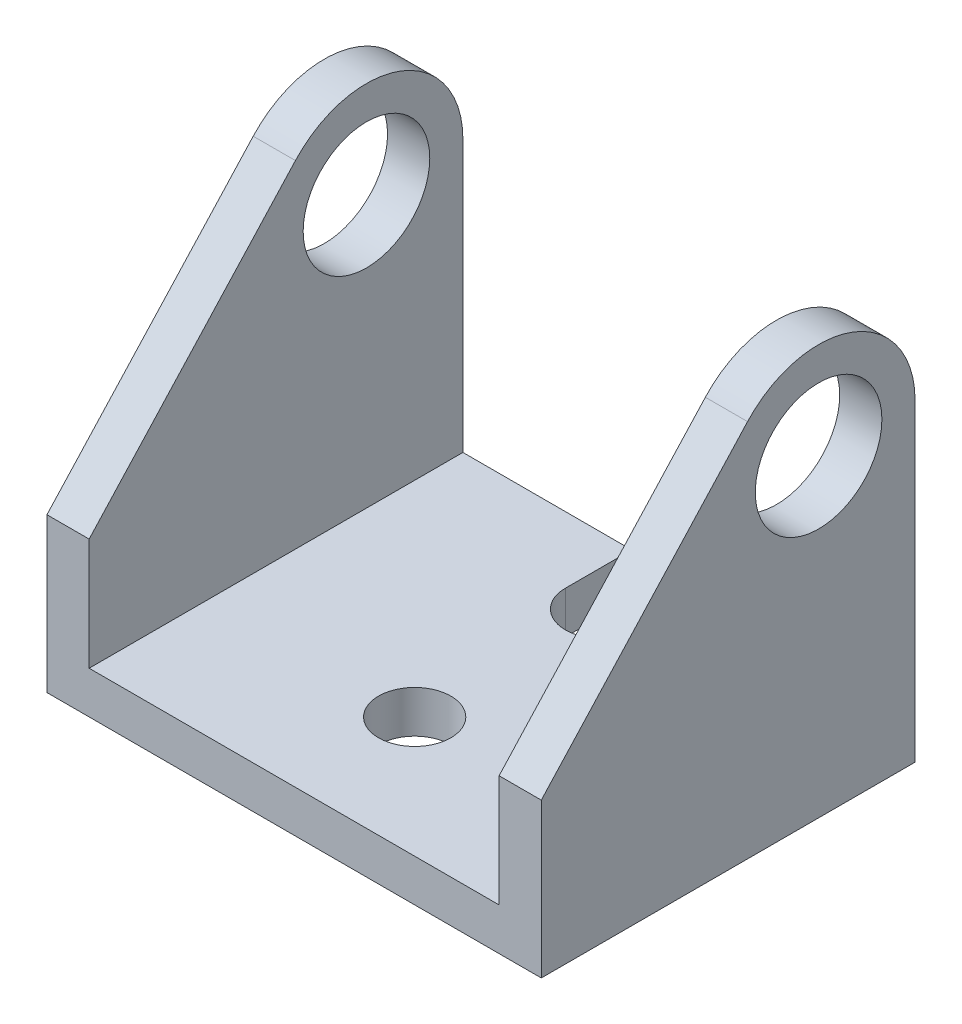
ISO-10303-21;
HEADER;
FILE_DESCRIPTION(('STEP AP214'),'2;1');
FILE_NAME('part.step','',(''),(''),'','','');
FILE_SCHEMA(('AUTOMOTIVE_DESIGN { 1 0 10303 214 1 1 1 1 }'));
ENDSEC;
DATA;
#1=APPLICATION_CONTEXT('core data for automotive mechanical design processes');
#2=APPLICATION_PROTOCOL_DEFINITION('international standard','automotive_design',2000,#1);
#3=PRODUCT_CONTEXT('',#1,'mechanical');
#4=PRODUCT('Part','Part','',(#3));
#5=PRODUCT_RELATED_PRODUCT_CATEGORY('part','',(#4));
#6=PRODUCT_DEFINITION_FORMATION('','',#4);
#7=PRODUCT_DEFINITION_CONTEXT('part definition',#1,'design');
#8=PRODUCT_DEFINITION('design','',#6,#7);
#9=PRODUCT_DEFINITION_SHAPE('','',#8);
#10=(LENGTH_UNIT() NAMED_UNIT(*) SI_UNIT(.MILLI.,.METRE.));
#11=(NAMED_UNIT(*) PLANE_ANGLE_UNIT() SI_UNIT($,.RADIAN.));
#12=(NAMED_UNIT(*) SI_UNIT($,.STERADIAN.) SOLID_ANGLE_UNIT());
#13=UNCERTAINTY_MEASURE_WITH_UNIT(LENGTH_MEASURE(1.E-05),#10,'distance_accuracy_value','');
#14=(GEOMETRIC_REPRESENTATION_CONTEXT(3) GLOBAL_UNCERTAINTY_ASSIGNED_CONTEXT((#13)) GLOBAL_UNIT_ASSIGNED_CONTEXT((#10,
#11,#12)) REPRESENTATION_CONTEXT('',''));
#15=CARTESIAN_POINT('',(0.,0.,0.));
#16=DIRECTION('',(0.,0.,1.));
#17=DIRECTION('',(1.,0.,0.));
#18=AXIS2_PLACEMENT_3D('',#15,#16,#17);
#19=CARTESIAN_POINT('',(-20.5,3.5,-15.5));
#20=DIRECTION('',(0.,0.,1.));
#21=DIRECTION('',(1.,0.,0.));
#22=AXIS2_PLACEMENT_3D('',#19,#20,#21);
#23=PLANE('',#22);
#24=DIRECTION('',(-1.,0.,0.));
#25=VECTOR('',#24,1.);
#26=CARTESIAN_POINT('',(-20.5,3.5,-15.5));
#27=LINE('',#26,#25);
#28=CARTESIAN_POINT('',(-3.,3.5,-15.5));
#29=VERTEX_POINT('',#28);
#30=CARTESIAN_POINT('',(-17.,3.5,-15.5));
#31=VERTEX_POINT('',#30);
#32=EDGE_CURVE('E221',#29,#31,#27,.T.);
#33=ORIENTED_EDGE('',*,*,#32,.F.);
#34=DIRECTION('',(0.,1.,0.));
#35=VECTOR('',#34,1.);
#36=CARTESIAN_POINT('',(-3.,-36.5,-15.5));
#37=LINE('',#36,#35);
#38=CARTESIAN_POINT('',(-3.,0.,-15.5));
#39=VERTEX_POINT('',#38);
#40=EDGE_CURVE('E165',#39,#29,#37,.T.);
#41=ORIENTED_EDGE('',*,*,#40,.F.);
#42=DIRECTION('',(-1.,0.,0.));
#43=VECTOR('',#42,1.);
#44=CARTESIAN_POINT('',(-20.5,0.,-15.5));
#45=LINE('',#44,#43);
#46=CARTESIAN_POINT('',(-20.5,0.,-15.5));
#47=VERTEX_POINT('',#46);
#48=EDGE_CURVE('E227',#39,#47,#45,.T.);
#49=ORIENTED_EDGE('',*,*,#48,.T.);
#50=DIRECTION('',(0.,-1.,0.));
#51=VECTOR('',#50,1.);
#52=CARTESIAN_POINT('',(-20.5,3.5,-15.5));
#53=LINE('',#52,#51);
#54=CARTESIAN_POINT('',(-20.5,26.,-15.5));
#55=VERTEX_POINT('',#54);
#56=EDGE_CURVE('E240',#55,#47,#53,.T.);
#57=ORIENTED_EDGE('',*,*,#56,.F.);
#58=DIRECTION('',(1.,0.,0.));
#59=VECTOR('',#58,1.);
#60=CARTESIAN_POINT('',(-20.5,26.,-15.5));
#61=LINE('',#60,#59);
#62=CARTESIAN_POINT('',(-17.,26.,-15.5));
#63=VERTEX_POINT('',#62);
#64=EDGE_CURVE('E186',#55,#63,#61,.T.);
#65=ORIENTED_EDGE('',*,*,#64,.T.);
#66=DIRECTION('',(0.,-1.,0.));
#67=VECTOR('',#66,1.);
#68=CARTESIAN_POINT('',(-17.,43.5,-15.5));
#69=LINE('',#68,#67);
#70=EDGE_CURVE('E213',#63,#31,#69,.T.);
#71=ORIENTED_EDGE('',*,*,#70,.T.);
#72=EDGE_LOOP('',(#33,#41,#49,#57,#65,#71));
#73=FACE_BOUND('',#72,.T.);
#74=ADVANCED_FACE('F35',(#73),#23,.F.);
#75=CARTESIAN_POINT('',(20.5,0.,-15.5));
#76=VERTEX_POINT('',#75);
#77=CARTESIAN_POINT('',(3.,0.,-15.5));
#78=VERTEX_POINT('',#77);
#79=EDGE_CURVE('E228',#76,#78,#45,.T.);
#80=ORIENTED_EDGE('',*,*,#79,.T.);
#81=DIRECTION('',(0.,1.,0.));
#82=VECTOR('',#81,1.);
#83=CARTESIAN_POINT('',(3.,-36.5,-15.5));
#84=LINE('',#83,#82);
#85=CARTESIAN_POINT('',(3.,3.5,-15.5));
#86=VERTEX_POINT('',#85);
#87=EDGE_CURVE('E51',#78,#86,#84,.T.);
#88=ORIENTED_EDGE('',*,*,#87,.T.);
#89=CARTESIAN_POINT('',(17.,3.5,-15.5));
#90=VERTEX_POINT('',#89);
#91=EDGE_CURVE('E158',#90,#86,#27,.T.);
#92=ORIENTED_EDGE('',*,*,#91,.F.);
#93=DIRECTION('',(0.,-1.,0.));
#94=VECTOR('',#93,1.);
#95=CARTESIAN_POINT('',(17.,43.5,-15.5));
#96=LINE('',#95,#94);
#97=CARTESIAN_POINT('',(17.,26.,-15.5));
#98=VERTEX_POINT('',#97);
#99=EDGE_CURVE('E208',#98,#90,#96,.T.);
#100=ORIENTED_EDGE('',*,*,#99,.F.);
#101=CARTESIAN_POINT('',(20.5,26.,-15.5));
#102=VERTEX_POINT('',#101);
#103=EDGE_CURVE('E175',#98,#102,#61,.T.);
#104=ORIENTED_EDGE('',*,*,#103,.T.);
#105=DIRECTION('',(0.,-1.,0.));
#106=VECTOR('',#105,1.);
#107=CARTESIAN_POINT('',(20.5,3.5,-15.5));
#108=LINE('',#107,#106);
#109=EDGE_CURVE('E243',#102,#76,#108,.T.);
#110=ORIENTED_EDGE('',*,*,#109,.T.);
#111=EDGE_LOOP('',(#80,#88,#92,#100,#104,#110));
#112=FACE_BOUND('',#111,.T.);
#113=ADVANCED_FACE('F279',(#112),#23,.F.);
#114=CARTESIAN_POINT('',(0.,3.5,0.));
#115=DIRECTION('',(0.,1.,0.));
#116=DIRECTION('',(0.,0.,1.));
#117=AXIS2_PLACEMENT_3D('',#114,#115,#116);
#118=PLANE('',#117);
#119=CARTESIAN_POINT('',(0.,3.5,5.5));
#120=DIRECTION('',(0.,1.,0.));
#121=DIRECTION('',(0.,0.,1.));
#122=AXIS2_PLACEMENT_3D('',#119,#120,#121);
#123=CIRCLE('',#122,3.);
#124=CARTESIAN_POINT('',(0.,3.5,8.5));
#125=VERTEX_POINT('',#124);
#126=EDGE_CURVE('E459',#125,#125,#123,.T.);
#127=ORIENTED_EDGE('',*,*,#126,.F.);
#128=EDGE_LOOP('',(#127));
#129=FACE_BOUND('',#128,.T.);
#130=DIRECTION('',(0.,0.,1.));
#131=VECTOR('',#130,1.);
#132=CARTESIAN_POINT('',(-3.,3.5,-10.));
#133=LINE('',#132,#131);
#134=CARTESIAN_POINT('',(-3.,3.5,-10.));
#135=VERTEX_POINT('',#134);
#136=EDGE_CURVE('E143',#29,#135,#133,.T.);
#137=ORIENTED_EDGE('',*,*,#136,.F.);
#138=ORIENTED_EDGE('',*,*,#32,.T.);
#139=DIRECTION('',(0.,0.,-1.));
#140=VECTOR('',#139,1.);
#141=CARTESIAN_POINT('',(-17.,3.5,-15.5));
#142=LINE('',#141,#140);
#143=CARTESIAN_POINT('',(-17.,3.5,15.5));
#144=VERTEX_POINT('',#143);
#145=EDGE_CURVE('E210',#144,#31,#142,.T.);
#146=ORIENTED_EDGE('',*,*,#145,.F.);
#147=DIRECTION('',(1.,0.,0.));
#148=VECTOR('',#147,1.);
#149=CARTESIAN_POINT('',(-20.5,3.5,15.5));
#150=LINE('',#149,#148);
#151=CARTESIAN_POINT('',(17.,3.5,15.5));
#152=VERTEX_POINT('',#151);
#153=EDGE_CURVE('E220',#144,#152,#150,.T.);
#154=ORIENTED_EDGE('',*,*,#153,.T.);
#155=DIRECTION('',(0.,0.,1.));
#156=VECTOR('',#155,1.);
#157=CARTESIAN_POINT('',(17.,3.5,-15.5));
#158=LINE('',#157,#156);
#159=EDGE_CURVE('E203',#90,#152,#158,.T.);
#160=ORIENTED_EDGE('',*,*,#159,.F.);
#161=ORIENTED_EDGE('',*,*,#91,.T.);
#162=DIRECTION('',(0.,0.,-1.));
#163=VECTOR('',#162,1.);
#164=CARTESIAN_POINT('',(3.,3.5,-10.));
#165=LINE('',#164,#163);
#166=CARTESIAN_POINT('',(3.,3.5,-10.));
#167=VERTEX_POINT('',#166);
#168=EDGE_CURVE('E139',#167,#86,#165,.T.);
#169=ORIENTED_EDGE('',*,*,#168,.F.);
#170=CARTESIAN_POINT('',(0.,3.5,-10.));
#171=DIRECTION('',(0.,1.,0.));
#172=DIRECTION('',(0.,0.,1.));
#173=AXIS2_PLACEMENT_3D('',#170,#171,#172);
#174=CIRCLE('',#173,3.);
#175=EDGE_CURVE('E146',#135,#167,#174,.T.);
#176=ORIENTED_EDGE('',*,*,#175,.F.);
#177=EDGE_LOOP('',(#137,#138,#146,#154,#160,#161,#169,#176));
#178=FACE_BOUND('',#177,.T.);
#179=ADVANCED_FACE('F155',(#129,#178),#118,.T.);
#180=CARTESIAN_POINT('',(20.5,3.5,-15.5));
#181=DIRECTION('',(-1.,0.,0.));
#182=DIRECTION('',(0.,0.,1.));
#183=AXIS2_PLACEMENT_3D('',#180,#181,#182);
#184=PLANE('',#183);
#185=CARTESIAN_POINT('',(20.5,26.,-7.5));
#186=DIRECTION('',(1.,0.,0.));
#187=DIRECTION('',(0.,0.,-1.));
#188=AXIS2_PLACEMENT_3D('',#185,#186,#187);
#189=CIRCLE('',#188,5.25);
#190=CARTESIAN_POINT('',(20.5,26.,-12.75));
#191=VERTEX_POINT('',#190);
#192=EDGE_CURVE('E193',#191,#191,#189,.T.);
#193=ORIENTED_EDGE('',*,*,#192,.F.);
#194=EDGE_LOOP('',(#193));
#195=FACE_BOUND('',#194,.T.);
#196=ORIENTED_EDGE('',*,*,#109,.F.);
#197=CARTESIAN_POINT('',(20.5,26.,-7.5));
#198=DIRECTION('',(-1.,0.,0.));
#199=DIRECTION('',(0.,0.,-1.));
#200=AXIS2_PLACEMENT_3D('',#197,#198,#199);
#201=CIRCLE('',#200,8.);
#202=CARTESIAN_POINT('',(20.5,31.4103668795127,-1.60695916957365));
#203=VERTEX_POINT('',#202);
#204=EDGE_CURVE('E164',#203,#102,#201,.T.);
#205=ORIENTED_EDGE('',*,*,#204,.F.);
#206=DIRECTION('',(0.,0.736630103803293,-0.676295859939087));
#207=VECTOR('',#206,1.);
#208=CARTESIAN_POINT('',(20.5,31.4103668795127,-1.60695916957365));
#209=LINE('',#208,#207);
#210=CARTESIAN_POINT('',(20.5,12.7772480696818,15.5));
#211=VERTEX_POINT('',#210);
#212=EDGE_CURVE('E172',#211,#203,#209,.T.);
#213=ORIENTED_EDGE('',*,*,#212,.F.);
#214=DIRECTION('',(0.,-1.,0.));
#215=VECTOR('',#214,1.);
#216=CARTESIAN_POINT('',(20.5,3.5,15.5));
#217=LINE('',#216,#215);
#218=CARTESIAN_POINT('',(20.5,0.,15.5));
#219=VERTEX_POINT('',#218);
#220=EDGE_CURVE('E224',#211,#219,#217,.T.);
#221=ORIENTED_EDGE('',*,*,#220,.T.);
#222=DIRECTION('',(0.,0.,-1.));
#223=VECTOR('',#222,1.);
#224=CARTESIAN_POINT('',(20.5,0.,-15.5));
#225=LINE('',#224,#223);
#226=EDGE_CURVE('E218',#219,#76,#225,.T.);
#227=ORIENTED_EDGE('',*,*,#226,.T.);
#228=EDGE_LOOP('',(#196,#205,#213,#221,#227));
#229=FACE_BOUND('',#228,.T.);
#230=ADVANCED_FACE('F37',(#195,#229),#184,.F.);
#231=CARTESIAN_POINT('',(-20.5,3.5,-15.5));
#232=DIRECTION('',(1.,0.,0.));
#233=DIRECTION('',(0.,0.,-1.));
#234=AXIS2_PLACEMENT_3D('',#231,#232,#233);
#235=PLANE('',#234);
#236=CARTESIAN_POINT('',(-20.5,26.,-7.5));
#237=DIRECTION('',(1.,0.,0.));
#238=DIRECTION('',(0.,0.,-1.));
#239=AXIS2_PLACEMENT_3D('',#236,#237,#238);
#240=CIRCLE('',#239,5.25);
#241=CARTESIAN_POINT('',(-20.5,26.,-12.75));
#242=VERTEX_POINT('',#241);
#243=EDGE_CURVE('E194',#242,#242,#240,.T.);
#244=ORIENTED_EDGE('',*,*,#243,.T.);
#245=EDGE_LOOP('',(#244));
#246=FACE_BOUND('',#245,.T.);
#247=DIRECTION('',(0.,0.736630103803293,-0.676295859939087));
#248=VECTOR('',#247,1.);
#249=CARTESIAN_POINT('',(-20.5,31.4103668795127,-1.60695916957365));
#250=LINE('',#249,#248);
#251=CARTESIAN_POINT('',(-20.5,12.7772480696818,15.5));
#252=VERTEX_POINT('',#251);
#253=CARTESIAN_POINT('',(-20.5,31.4103668795127,-1.60695916957365));
#254=VERTEX_POINT('',#253);
#255=EDGE_CURVE('E171',#252,#254,#250,.T.);
#256=ORIENTED_EDGE('',*,*,#255,.T.);
#257=CARTESIAN_POINT('',(-20.5,26.,-7.5));
#258=DIRECTION('',(-1.,0.,0.));
#259=DIRECTION('',(0.,0.,-1.));
#260=AXIS2_PLACEMENT_3D('',#257,#258,#259);
#261=CIRCLE('',#260,8.);
#262=EDGE_CURVE('E168',#254,#55,#261,.T.);
#263=ORIENTED_EDGE('',*,*,#262,.T.);
#264=ORIENTED_EDGE('',*,*,#56,.T.);
#265=DIRECTION('',(0.,0.,1.));
#266=VECTOR('',#265,1.);
#267=CARTESIAN_POINT('',(-20.5,0.,-15.5));
#268=LINE('',#267,#266);
#269=CARTESIAN_POINT('',(-20.5,0.,15.5));
#270=VERTEX_POINT('',#269);
#271=EDGE_CURVE('E231',#47,#270,#268,.T.);
#272=ORIENTED_EDGE('',*,*,#271,.T.);
#273=DIRECTION('',(0.,-1.,0.));
#274=VECTOR('',#273,1.);
#275=CARTESIAN_POINT('',(-20.5,3.5,15.5));
#276=LINE('',#275,#274);
#277=EDGE_CURVE('E238',#252,#270,#276,.T.);
#278=ORIENTED_EDGE('',*,*,#277,.F.);
#279=EDGE_LOOP('',(#256,#263,#264,#272,#278));
#280=FACE_BOUND('',#279,.T.);
#281=ADVANCED_FACE('F290',(#246,#280),#235,.F.);
#282=CARTESIAN_POINT('',(-20.5,3.5,15.5));
#283=DIRECTION('',(0.,0.,-1.));
#284=DIRECTION('',(-1.,0.,0.));
#285=AXIS2_PLACEMENT_3D('',#282,#283,#284);
#286=PLANE('',#285);
#287=ORIENTED_EDGE('',*,*,#220,.F.);
#288=DIRECTION('',(1.,0.,0.));
#289=VECTOR('',#288,1.);
#290=CARTESIAN_POINT('',(-20.5,12.7772480696818,15.5));
#291=LINE('',#290,#289);
#292=CARTESIAN_POINT('',(17.,12.7772480696818,15.5));
#293=VERTEX_POINT('',#292);
#294=EDGE_CURVE('E185',#293,#211,#291,.T.);
#295=ORIENTED_EDGE('',*,*,#294,.F.);
#296=DIRECTION('',(0.,-1.,0.));
#297=VECTOR('',#296,1.);
#298=CARTESIAN_POINT('',(17.,43.5,15.5));
#299=LINE('',#298,#297);
#300=EDGE_CURVE('E206',#293,#152,#299,.T.);
#301=ORIENTED_EDGE('',*,*,#300,.T.);
#302=ORIENTED_EDGE('',*,*,#153,.F.);
#303=DIRECTION('',(0.,-1.,0.));
#304=VECTOR('',#303,1.);
#305=CARTESIAN_POINT('',(-17.,43.5,15.5));
#306=LINE('',#305,#304);
#307=CARTESIAN_POINT('',(-17.,12.7772480696818,15.5));
#308=VERTEX_POINT('',#307);
#309=EDGE_CURVE('E216',#308,#144,#306,.T.);
#310=ORIENTED_EDGE('',*,*,#309,.F.);
#311=EDGE_CURVE('E59',#252,#308,#291,.T.);
#312=ORIENTED_EDGE('',*,*,#311,.F.);
#313=ORIENTED_EDGE('',*,*,#277,.T.);
#314=DIRECTION('',(1.,0.,0.));
#315=VECTOR('',#314,1.);
#316=CARTESIAN_POINT('',(-20.5,0.,15.5));
#317=LINE('',#316,#315);
#318=EDGE_CURVE('E234',#270,#219,#317,.T.);
#319=ORIENTED_EDGE('',*,*,#318,.T.);
#320=EDGE_LOOP('',(#287,#295,#301,#302,#310,#312,#313,#319));
#321=FACE_BOUND('',#320,.T.);
#322=ADVANCED_FACE('F272',(#321),#286,.F.);
#323=CARTESIAN_POINT('',(0.,0.,0.));
#324=DIRECTION('',(0.,1.,0.));
#325=DIRECTION('',(0.,0.,1.));
#326=AXIS2_PLACEMENT_3D('',#323,#324,#325);
#327=PLANE('',#326);
#328=CARTESIAN_POINT('',(0.,0.,5.5));
#329=DIRECTION('',(0.,1.,0.));
#330=DIRECTION('',(0.,0.,1.));
#331=AXIS2_PLACEMENT_3D('',#328,#329,#330);
#332=CIRCLE('',#331,3.);
#333=CARTESIAN_POINT('',(0.,0.,8.5));
#334=VERTEX_POINT('',#333);
#335=EDGE_CURVE('E39',#334,#334,#332,.T.);
#336=ORIENTED_EDGE('',*,*,#335,.T.);
#337=EDGE_LOOP('',(#336));
#338=FACE_BOUND('',#337,.T.);
#339=ORIENTED_EDGE('',*,*,#48,.F.);
#340=DIRECTION('',(0.,0.,1.));
#341=VECTOR('',#340,1.);
#342=CARTESIAN_POINT('',(-3.,0.,0.));
#343=LINE('',#342,#341);
#344=CARTESIAN_POINT('',(-3.,0.,-10.));
#345=VERTEX_POINT('',#344);
#346=EDGE_CURVE('E11',#39,#345,#343,.T.);
#347=ORIENTED_EDGE('',*,*,#346,.T.);
#348=CARTESIAN_POINT('',(0.,0.,-10.));
#349=DIRECTION('',(0.,1.,0.));
#350=DIRECTION('',(0.,0.,1.));
#351=AXIS2_PLACEMENT_3D('',#348,#349,#350);
#352=CIRCLE('',#351,3.);
#353=CARTESIAN_POINT('',(3.,0.,-10.));
#354=VERTEX_POINT('',#353);
#355=EDGE_CURVE('E44',#345,#354,#352,.T.);
#356=ORIENTED_EDGE('',*,*,#355,.T.);
#357=DIRECTION('',(0.,0.,-1.));
#358=VECTOR('',#357,1.);
#359=CARTESIAN_POINT('',(3.,0.,0.));
#360=LINE('',#359,#358);
#361=EDGE_CURVE('E140',#354,#78,#360,.T.);
#362=ORIENTED_EDGE('',*,*,#361,.T.);
#363=ORIENTED_EDGE('',*,*,#79,.F.);
#364=ORIENTED_EDGE('',*,*,#226,.F.);
#365=ORIENTED_EDGE('',*,*,#318,.F.);
#366=ORIENTED_EDGE('',*,*,#271,.F.);
#367=EDGE_LOOP('',(#339,#347,#356,#362,#363,#364,#365,#366));
#368=FACE_BOUND('',#367,.T.);
#369=ADVANCED_FACE('F256',(#338,#368),#327,.F.);
#370=CARTESIAN_POINT('',(-17.,43.5,-15.5));
#371=DIRECTION('',(-1.,0.,0.));
#372=DIRECTION('',(0.,0.,1.));
#373=AXIS2_PLACEMENT_3D('',#370,#371,#372);
#374=PLANE('',#373);
#375=CARTESIAN_POINT('',(-17.,26.,-7.5));
#376=DIRECTION('',(-1.,0.,0.));
#377=DIRECTION('',(0.,0.,1.));
#378=AXIS2_PLACEMENT_3D('',#375,#376,#377);
#379=CIRCLE('',#378,5.25);
#380=CARTESIAN_POINT('',(-17.,26.,-2.25));
#381=VERTEX_POINT('',#380);
#382=EDGE_CURVE('E200',#381,#381,#379,.T.);
#383=ORIENTED_EDGE('',*,*,#382,.T.);
#384=EDGE_LOOP('',(#383));
#385=FACE_BOUND('',#384,.T.);
#386=ORIENTED_EDGE('',*,*,#70,.F.);
#387=CARTESIAN_POINT('',(-17.,26.,-7.5));
#388=DIRECTION('',(-1.,0.,0.));
#389=DIRECTION('',(0.,0.,1.));
#390=AXIS2_PLACEMENT_3D('',#387,#388,#389);
#391=CIRCLE('',#390,8.);
#392=CARTESIAN_POINT('',(-17.,31.4103668795127,-1.60695916957365));
#393=VERTEX_POINT('',#392);
#394=EDGE_CURVE('E190',#63,#393,#391,.F.);
#395=ORIENTED_EDGE('',*,*,#394,.T.);
#396=DIRECTION('',(0.,-0.736630103803293,0.676295859939087));
#397=VECTOR('',#396,1.);
#398=CARTESIAN_POINT('',(-17.,44.8917244175939,-13.9841159573413));
#399=LINE('',#398,#397);
#400=EDGE_CURVE('E182',#393,#308,#399,.T.);
#401=ORIENTED_EDGE('',*,*,#400,.T.);
#402=ORIENTED_EDGE('',*,*,#309,.T.);
#403=ORIENTED_EDGE('',*,*,#145,.T.);
#404=EDGE_LOOP('',(#386,#395,#401,#402,#403));
#405=FACE_BOUND('',#404,.T.);
#406=ADVANCED_FACE('F267',(#385,#405),#374,.F.);
#407=CARTESIAN_POINT('',(17.,43.5,-15.5));
#408=DIRECTION('',(1.,0.,0.));
#409=DIRECTION('',(0.,0.,-1.));
#410=AXIS2_PLACEMENT_3D('',#407,#408,#409);
#411=PLANE('',#410);
#412=CARTESIAN_POINT('',(17.,26.,-7.5));
#413=DIRECTION('',(1.,0.,0.));
#414=DIRECTION('',(0.,0.,-1.));
#415=AXIS2_PLACEMENT_3D('',#412,#413,#414);
#416=CIRCLE('',#415,5.25);
#417=CARTESIAN_POINT('',(17.,26.,-12.75));
#418=VERTEX_POINT('',#417);
#419=EDGE_CURVE('E197',#418,#418,#416,.T.);
#420=ORIENTED_EDGE('',*,*,#419,.T.);
#421=EDGE_LOOP('',(#420));
#422=FACE_BOUND('',#421,.T.);
#423=DIRECTION('',(0.,0.736630103803293,-0.676295859939087));
#424=VECTOR('',#423,1.);
#425=CARTESIAN_POINT('',(17.,44.8917244175939,-13.9841159573413));
#426=LINE('',#425,#424);
#427=CARTESIAN_POINT('',(17.,31.4103668795127,-1.60695916957364));
#428=VERTEX_POINT('',#427);
#429=EDGE_CURVE('E245',#293,#428,#426,.T.);
#430=ORIENTED_EDGE('',*,*,#429,.T.);
#431=CARTESIAN_POINT('',(17.,26.,-7.5));
#432=DIRECTION('',(1.,0.,0.));
#433=DIRECTION('',(0.,0.,-1.));
#434=AXIS2_PLACEMENT_3D('',#431,#432,#433);
#435=CIRCLE('',#434,8.);
#436=EDGE_CURVE('E250',#428,#98,#435,.F.);
#437=ORIENTED_EDGE('',*,*,#436,.T.);
#438=ORIENTED_EDGE('',*,*,#99,.T.);
#439=ORIENTED_EDGE('',*,*,#159,.T.);
#440=ORIENTED_EDGE('',*,*,#300,.F.);
#441=EDGE_LOOP('',(#430,#437,#438,#439,#440));
#442=FACE_BOUND('',#441,.T.);
#443=ADVANCED_FACE('F276',(#422,#442),#411,.F.);
#444=CARTESIAN_POINT('',(-20.5,26.,-7.5));
#445=DIRECTION('',(1.,0.,0.));
#446=DIRECTION('',(0.,0.,-1.));
#447=AXIS2_PLACEMENT_3D('',#444,#445,#446);
#448=CYLINDRICAL_SURFACE('',#447,5.25);
#449=ORIENTED_EDGE('',*,*,#192,.T.);
#450=EDGE_LOOP('',(#449));
#451=FACE_BOUND('',#450,.T.);
#452=ORIENTED_EDGE('',*,*,#419,.F.);
#453=EDGE_LOOP('',(#452));
#454=FACE_BOUND('',#453,.T.);
#455=ADVANCED_FACE('F330',(#451,#454),#448,.F.);
#456=ORIENTED_EDGE('',*,*,#243,.F.);
#457=EDGE_LOOP('',(#456));
#458=FACE_BOUND('',#457,.T.);
#459=ORIENTED_EDGE('',*,*,#382,.F.);
#460=EDGE_LOOP('',(#459));
#461=FACE_BOUND('',#460,.T.);
#462=ADVANCED_FACE('F307',(#458,#461),#448,.F.);
#463=CARTESIAN_POINT('',(-20.5,31.4103668795127,-1.60695916957365));
#464=DIRECTION('',(0.,-0.676295859939087,-0.736630103803293));
#465=DIRECTION('',(0.,0.736630103803293,-0.676295859939087));
#466=AXIS2_PLACEMENT_3D('',#463,#464,#465);
#467=PLANE('',#466);
#468=ORIENTED_EDGE('',*,*,#294,.T.);
#469=ORIENTED_EDGE('',*,*,#212,.T.);
#470=DIRECTION('',(1.,0.,0.));
#471=VECTOR('',#470,1.);
#472=CARTESIAN_POINT('',(-20.5,31.4103668795127,-1.60695916957365));
#473=LINE('',#472,#471);
#474=EDGE_CURVE('E183',#428,#203,#473,.T.);
#475=ORIENTED_EDGE('',*,*,#474,.F.);
#476=ORIENTED_EDGE('',*,*,#429,.F.);
#477=EDGE_LOOP('',(#468,#469,#475,#476));
#478=FACE_BOUND('',#477,.T.);
#479=ADVANCED_FACE('F297',(#478),#467,.F.);
#480=CARTESIAN_POINT('',(-20.5,26.,-7.5));
#481=DIRECTION('',(1.,0.,0.));
#482=DIRECTION('',(0.,0.,-1.));
#483=AXIS2_PLACEMENT_3D('',#480,#481,#482);
#484=CYLINDRICAL_SURFACE('',#483,8.);
#485=ORIENTED_EDGE('',*,*,#474,.T.);
#486=ORIENTED_EDGE('',*,*,#204,.T.);
#487=ORIENTED_EDGE('',*,*,#103,.F.);
#488=ORIENTED_EDGE('',*,*,#436,.F.);
#489=EDGE_LOOP('',(#485,#486,#487,#488));
#490=FACE_BOUND('',#489,.T.);
#491=ADVANCED_FACE('F304',(#490),#484,.T.);
#492=ORIENTED_EDGE('',*,*,#64,.F.);
#493=ORIENTED_EDGE('',*,*,#262,.F.);
#494=EDGE_CURVE('E179',#254,#393,#473,.T.);
#495=ORIENTED_EDGE('',*,*,#494,.T.);
#496=ORIENTED_EDGE('',*,*,#394,.F.);
#497=EDGE_LOOP('',(#492,#493,#495,#496));
#498=FACE_BOUND('',#497,.T.);
#499=ADVANCED_FACE('F293',(#498),#484,.T.);
#500=ORIENTED_EDGE('',*,*,#494,.F.);
#501=ORIENTED_EDGE('',*,*,#255,.F.);
#502=ORIENTED_EDGE('',*,*,#311,.T.);
#503=ORIENTED_EDGE('',*,*,#400,.F.);
#504=EDGE_LOOP('',(#500,#501,#502,#503));
#505=FACE_BOUND('',#504,.T.);
#506=ADVANCED_FACE('F294',(#505),#467,.F.);
#507=CARTESIAN_POINT('',(0.,-36.5,-10.));
#508=DIRECTION('',(0.,1.,0.));
#509=DIRECTION('',(0.,0.,1.));
#510=AXIS2_PLACEMENT_3D('',#507,#508,#509);
#511=CYLINDRICAL_SURFACE('',#510,3.);
#512=DIRECTION('',(0.,1.,0.));
#513=VECTOR('',#512,1.);
#514=CARTESIAN_POINT('',(-3.,-36.5,-10.));
#515=LINE('',#514,#513);
#516=EDGE_CURVE('E149',#345,#135,#515,.T.);
#517=ORIENTED_EDGE('',*,*,#516,.T.);
#518=ORIENTED_EDGE('',*,*,#175,.T.);
#519=DIRECTION('',(0.,1.,0.));
#520=VECTOR('',#519,1.);
#521=CARTESIAN_POINT('',(3.,-36.5,-10.));
#522=LINE('',#521,#520);
#523=EDGE_CURVE('E135',#354,#167,#522,.T.);
#524=ORIENTED_EDGE('',*,*,#523,.F.);
#525=ORIENTED_EDGE('',*,*,#355,.F.);
#526=EDGE_LOOP('',(#517,#518,#524,#525));
#527=FACE_BOUND('',#526,.T.);
#528=ADVANCED_FACE('F147',(#527),#511,.F.);
#529=CARTESIAN_POINT('',(-3.,-36.5,-10.));
#530=DIRECTION('',(-1.,0.,0.));
#531=DIRECTION('',(0.,0.,1.));
#532=AXIS2_PLACEMENT_3D('',#529,#530,#531);
#533=PLANE('',#532);
#534=ORIENTED_EDGE('',*,*,#40,.T.);
#535=ORIENTED_EDGE('',*,*,#136,.T.);
#536=ORIENTED_EDGE('',*,*,#516,.F.);
#537=ORIENTED_EDGE('',*,*,#346,.F.);
#538=EDGE_LOOP('',(#534,#535,#536,#537));
#539=FACE_BOUND('',#538,.T.);
#540=ADVANCED_FACE('F259',(#539),#533,.F.);
#541=CARTESIAN_POINT('',(3.,-36.5,-10.));
#542=DIRECTION('',(1.,0.,0.));
#543=DIRECTION('',(0.,0.,-1.));
#544=AXIS2_PLACEMENT_3D('',#541,#542,#543);
#545=PLANE('',#544);
#546=ORIENTED_EDGE('',*,*,#523,.T.);
#547=ORIENTED_EDGE('',*,*,#168,.T.);
#548=ORIENTED_EDGE('',*,*,#87,.F.);
#549=ORIENTED_EDGE('',*,*,#361,.F.);
#550=EDGE_LOOP('',(#546,#547,#548,#549));
#551=FACE_BOUND('',#550,.T.);
#552=ADVANCED_FACE('F137',(#551),#545,.F.);
#553=CARTESIAN_POINT('',(0.,-36.5,5.5));
#554=DIRECTION('',(0.,1.,0.));
#555=DIRECTION('',(0.,0.,1.));
#556=AXIS2_PLACEMENT_3D('',#553,#554,#555);
#557=CYLINDRICAL_SURFACE('',#556,3.);
#558=ORIENTED_EDGE('',*,*,#126,.T.);
#559=EDGE_LOOP('',(#558));
#560=FACE_BOUND('',#559,.T.);
#561=ORIENTED_EDGE('',*,*,#335,.F.);
#562=EDGE_LOOP('',(#561));
#563=FACE_BOUND('',#562,.T.);
#564=ADVANCED_FACE('F442',(#560,#563),#557,.F.);
#565=CLOSED_SHELL('',(#74,#113,#179,#230,#281,#322,#369,#406,#443,#455,#462,#479,#491,#499,#506,
#528,#540,#552,#564));
#566=MANIFOLD_SOLID_BREP('B2',#565);
#567=ADVANCED_BREP_SHAPE_REPRESENTATION('',(#18,#566),#14);
#568=SHAPE_DEFINITION_REPRESENTATION(#9,#567);
ENDSEC;
END-ISO-10303-21;
